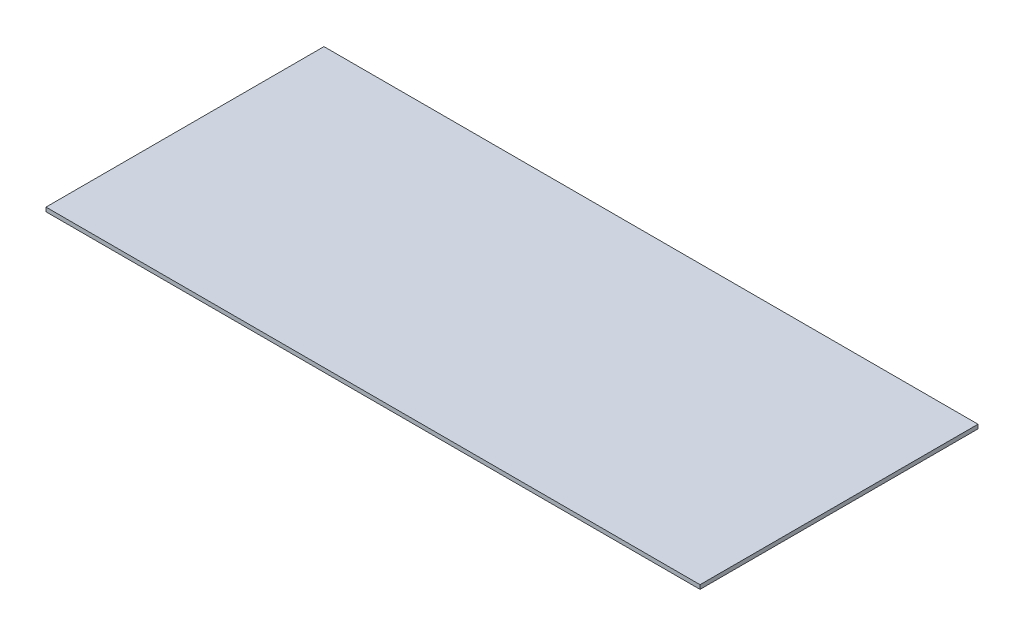
ISO-10303-21;
HEADER;
FILE_DESCRIPTION(('STEP AP214'),'2;1');
FILE_NAME('part.step','',(''),(''),'','','');
FILE_SCHEMA(('AUTOMOTIVE_DESIGN { 1 0 10303 214 1 1 1 1 }'));
ENDSEC;
DATA;
#1=APPLICATION_CONTEXT('core data for automotive mechanical design processes');
#2=APPLICATION_PROTOCOL_DEFINITION('international standard','automotive_design',2000,#1);
#3=PRODUCT_CONTEXT('',#1,'mechanical');
#4=PRODUCT('Part','Part','',(#3));
#5=PRODUCT_RELATED_PRODUCT_CATEGORY('part','',(#4));
#6=PRODUCT_DEFINITION_FORMATION('','',#4);
#7=PRODUCT_DEFINITION_CONTEXT('part definition',#1,'design');
#8=PRODUCT_DEFINITION('design','',#6,#7);
#9=PRODUCT_DEFINITION_SHAPE('','',#8);
#10=(LENGTH_UNIT() NAMED_UNIT(*) SI_UNIT(.MILLI.,.METRE.));
#11=(NAMED_UNIT(*) PLANE_ANGLE_UNIT() SI_UNIT($,.RADIAN.));
#12=(NAMED_UNIT(*) SI_UNIT($,.STERADIAN.) SOLID_ANGLE_UNIT());
#13=UNCERTAINTY_MEASURE_WITH_UNIT(LENGTH_MEASURE(1.E-05),#10,'distance_accuracy_value','');
#14=(GEOMETRIC_REPRESENTATION_CONTEXT(3) GLOBAL_UNCERTAINTY_ASSIGNED_CONTEXT((#13)) GLOBAL_UNIT_ASSIGNED_CONTEXT((#10,
#11,#12)) REPRESENTATION_CONTEXT('',''));
#15=CARTESIAN_POINT('',(0.,0.,0.));
#16=DIRECTION('',(0.,0.,1.));
#17=DIRECTION('',(1.,0.,0.));
#18=AXIS2_PLACEMENT_3D('',#15,#16,#17);
#19=CARTESIAN_POINT('',(254.,3.175,107.95));
#20=DIRECTION('',(-1.,0.,0.));
#21=DIRECTION('',(0.,0.,1.));
#22=AXIS2_PLACEMENT_3D('',#19,#20,#21);
#23=PLANE('',#22);
#24=DIRECTION('',(0.,0.,-1.));
#25=VECTOR('',#24,1.);
#26=CARTESIAN_POINT('',(254.,0.,107.95));
#27=LINE('',#26,#25);
#28=CARTESIAN_POINT('',(254.,0.,107.95));
#29=VERTEX_POINT('',#28);
#30=CARTESIAN_POINT('',(254.,0.,-107.95));
#31=VERTEX_POINT('',#30);
#32=EDGE_CURVE('E104',#29,#31,#27,.T.);
#33=ORIENTED_EDGE('',*,*,#32,.T.);
#34=DIRECTION('',(0.,-1.,0.));
#35=VECTOR('',#34,1.);
#36=CARTESIAN_POINT('',(254.,3.175,-107.95));
#37=LINE('',#36,#35);
#38=CARTESIAN_POINT('',(254.,3.175,-107.95));
#39=VERTEX_POINT('',#38);
#40=EDGE_CURVE('E11',#39,#31,#37,.T.);
#41=ORIENTED_EDGE('',*,*,#40,.F.);
#42=DIRECTION('',(0.,0.,-1.));
#43=VECTOR('',#42,1.);
#44=CARTESIAN_POINT('',(254.,3.175,107.95));
#45=LINE('',#44,#43);
#46=CARTESIAN_POINT('',(254.,3.175,107.95));
#47=VERTEX_POINT('',#46);
#48=EDGE_CURVE('E92',#47,#39,#45,.T.);
#49=ORIENTED_EDGE('',*,*,#48,.F.);
#50=DIRECTION('',(0.,-1.,0.));
#51=VECTOR('',#50,1.);
#52=CARTESIAN_POINT('',(254.,3.175,107.95));
#53=LINE('',#52,#51);
#54=EDGE_CURVE('E100',#47,#29,#53,.T.);
#55=ORIENTED_EDGE('',*,*,#54,.T.);
#56=EDGE_LOOP('',(#33,#41,#49,#55));
#57=FACE_BOUND('',#56,.T.);
#58=ADVANCED_FACE('F41',(#57),#23,.F.);
#59=CARTESIAN_POINT('',(-254.,3.175,-107.95));
#60=DIRECTION('',(0.,0.,1.));
#61=DIRECTION('',(1.,0.,0.));
#62=AXIS2_PLACEMENT_3D('',#59,#60,#61);
#63=PLANE('',#62);
#64=DIRECTION('',(-1.,0.,0.));
#65=VECTOR('',#64,1.);
#66=CARTESIAN_POINT('',(-254.,0.,-107.95));
#67=LINE('',#66,#65);
#68=CARTESIAN_POINT('',(-254.,0.,-107.95));
#69=VERTEX_POINT('',#68);
#70=EDGE_CURVE('E96',#31,#69,#67,.T.);
#71=ORIENTED_EDGE('',*,*,#70,.T.);
#72=DIRECTION('',(0.,-1.,0.));
#73=VECTOR('',#72,1.);
#74=CARTESIAN_POINT('',(-254.,3.175,-107.95));
#75=LINE('',#74,#73);
#76=CARTESIAN_POINT('',(-254.,3.175,-107.95));
#77=VERTEX_POINT('',#76);
#78=EDGE_CURVE('E49',#77,#69,#75,.T.);
#79=ORIENTED_EDGE('',*,*,#78,.F.);
#80=DIRECTION('',(-1.,0.,0.));
#81=VECTOR('',#80,1.);
#82=CARTESIAN_POINT('',(-254.,3.175,-107.95));
#83=LINE('',#82,#81);
#84=EDGE_CURVE('E87',#39,#77,#83,.T.);
#85=ORIENTED_EDGE('',*,*,#84,.F.);
#86=ORIENTED_EDGE('',*,*,#40,.T.);
#87=EDGE_LOOP('',(#71,#79,#85,#86));
#88=FACE_BOUND('',#87,.T.);
#89=ADVANCED_FACE('F95',(#88),#63,.F.);
#90=CARTESIAN_POINT('',(-254.,3.175,107.95));
#91=DIRECTION('',(1.,0.,0.));
#92=DIRECTION('',(0.,0.,-1.));
#93=AXIS2_PLACEMENT_3D('',#90,#91,#92);
#94=PLANE('',#93);
#95=DIRECTION('',(0.,0.,1.));
#96=VECTOR('',#95,1.);
#97=CARTESIAN_POINT('',(-254.,0.,107.95));
#98=LINE('',#97,#96);
#99=CARTESIAN_POINT('',(-254.,0.,107.95));
#100=VERTEX_POINT('',#99);
#101=EDGE_CURVE('E74',#69,#100,#98,.T.);
#102=ORIENTED_EDGE('',*,*,#101,.T.);
#103=DIRECTION('',(0.,-1.,0.));
#104=VECTOR('',#103,1.);
#105=CARTESIAN_POINT('',(-254.,3.175,107.95));
#106=LINE('',#105,#104);
#107=CARTESIAN_POINT('',(-254.,3.175,107.95));
#108=VERTEX_POINT('',#107);
#109=EDGE_CURVE('E97',#108,#100,#106,.T.);
#110=ORIENTED_EDGE('',*,*,#109,.F.);
#111=DIRECTION('',(0.,0.,1.));
#112=VECTOR('',#111,1.);
#113=CARTESIAN_POINT('',(-254.,3.175,107.95));
#114=LINE('',#113,#112);
#115=EDGE_CURVE('E90',#77,#108,#114,.T.);
#116=ORIENTED_EDGE('',*,*,#115,.F.);
#117=ORIENTED_EDGE('',*,*,#78,.T.);
#118=EDGE_LOOP('',(#102,#110,#116,#117));
#119=FACE_BOUND('',#118,.T.);
#120=ADVANCED_FACE('F98',(#119),#94,.F.);
#121=CARTESIAN_POINT('',(-254.,3.175,107.95));
#122=DIRECTION('',(0.,0.,-1.));
#123=DIRECTION('',(-1.,0.,0.));
#124=AXIS2_PLACEMENT_3D('',#121,#122,#123);
#125=PLANE('',#124);
#126=DIRECTION('',(1.,0.,0.));
#127=VECTOR('',#126,1.);
#128=CARTESIAN_POINT('',(-254.,0.,107.95));
#129=LINE('',#128,#127);
#130=EDGE_CURVE('E80',#100,#29,#129,.T.);
#131=ORIENTED_EDGE('',*,*,#130,.T.);
#132=ORIENTED_EDGE('',*,*,#54,.F.);
#133=DIRECTION('',(1.,0.,0.));
#134=VECTOR('',#133,1.);
#135=CARTESIAN_POINT('',(-254.,3.175,107.95));
#136=LINE('',#135,#134);
#137=EDGE_CURVE('E57',#108,#47,#136,.T.);
#138=ORIENTED_EDGE('',*,*,#137,.F.);
#139=ORIENTED_EDGE('',*,*,#109,.T.);
#140=EDGE_LOOP('',(#131,#132,#138,#139));
#141=FACE_BOUND('',#140,.T.);
#142=ADVANCED_FACE('F111',(#141),#125,.F.);
#143=CARTESIAN_POINT('',(0.,3.175,0.));
#144=DIRECTION('',(0.,-1.,0.));
#145=DIRECTION('',(0.,0.,-1.));
#146=AXIS2_PLACEMENT_3D('',#143,#144,#145);
#147=PLANE('',#146);
#148=ORIENTED_EDGE('',*,*,#48,.T.);
#149=ORIENTED_EDGE('',*,*,#84,.T.);
#150=ORIENTED_EDGE('',*,*,#115,.T.);
#151=ORIENTED_EDGE('',*,*,#137,.T.);
#152=EDGE_LOOP('',(#148,#149,#150,#151));
#153=FACE_BOUND('',#152,.T.);
#154=ADVANCED_FACE('F88',(#153),#147,.F.);
#155=CARTESIAN_POINT('',(0.,0.,0.));
#156=DIRECTION('',(0.,-1.,0.));
#157=DIRECTION('',(0.,0.,-1.));
#158=AXIS2_PLACEMENT_3D('',#155,#156,#157);
#159=PLANE('',#158);
#160=ORIENTED_EDGE('',*,*,#32,.F.);
#161=ORIENTED_EDGE('',*,*,#130,.F.);
#162=ORIENTED_EDGE('',*,*,#101,.F.);
#163=ORIENTED_EDGE('',*,*,#70,.F.);
#164=EDGE_LOOP('',(#160,#161,#162,#163));
#165=FACE_BOUND('',#164,.T.);
#166=ADVANCED_FACE('F114',(#165),#159,.T.);
#167=CLOSED_SHELL('',(#58,#89,#120,#142,#154,#166));
#168=MANIFOLD_SOLID_BREP('B2',#167);
#169=ADVANCED_BREP_SHAPE_REPRESENTATION('',(#18,#168),#14);
#170=SHAPE_DEFINITION_REPRESENTATION(#9,#169);
ENDSEC;
END-ISO-10303-21;
